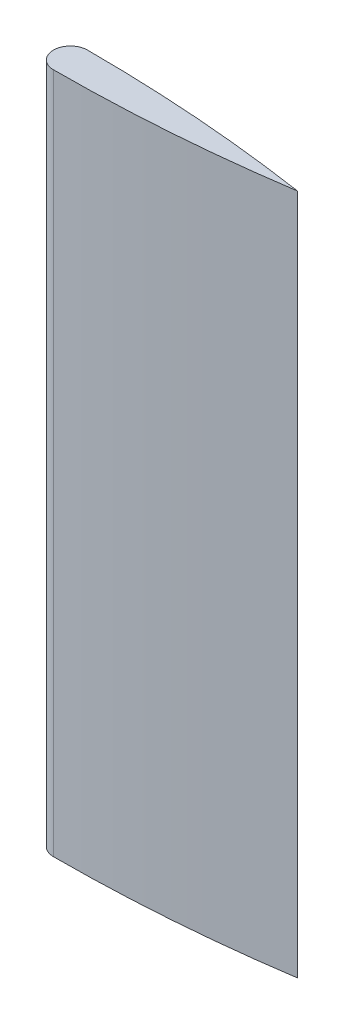
ISO-10303-21;
HEADER;
FILE_DESCRIPTION(('STEP AP214'),'2;1');
FILE_NAME('part.step','',(''),(''),'','','');
FILE_SCHEMA(('AUTOMOTIVE_DESIGN { 1 0 10303 214 1 1 1 1 }'));
ENDSEC;
DATA;
#1=APPLICATION_CONTEXT('core data for automotive mechanical design processes');
#2=APPLICATION_PROTOCOL_DEFINITION('international standard','automotive_design',2000,#1);
#3=PRODUCT_CONTEXT('',#1,'mechanical');
#4=PRODUCT('Part','Part','',(#3));
#5=PRODUCT_RELATED_PRODUCT_CATEGORY('part','',(#4));
#6=PRODUCT_DEFINITION_FORMATION('','',#4);
#7=PRODUCT_DEFINITION_CONTEXT('part definition',#1,'design');
#8=PRODUCT_DEFINITION('design','',#6,#7);
#9=PRODUCT_DEFINITION_SHAPE('','',#8);
#10=(LENGTH_UNIT() NAMED_UNIT(*) SI_UNIT(.MILLI.,.METRE.));
#11=(NAMED_UNIT(*) PLANE_ANGLE_UNIT() SI_UNIT($,.RADIAN.));
#12=(NAMED_UNIT(*) SI_UNIT($,.STERADIAN.) SOLID_ANGLE_UNIT());
#13=UNCERTAINTY_MEASURE_WITH_UNIT(LENGTH_MEASURE(1.E-05),#10,'distance_accuracy_value','');
#14=(GEOMETRIC_REPRESENTATION_CONTEXT(3) GLOBAL_UNCERTAINTY_ASSIGNED_CONTEXT((#13)) GLOBAL_UNIT_ASSIGNED_CONTEXT((#10,
#11,#12)) REPRESENTATION_CONTEXT('',''));
#15=CARTESIAN_POINT('',(0.,0.,0.));
#16=DIRECTION('',(0.,0.,1.));
#17=DIRECTION('',(1.,0.,0.));
#18=AXIS2_PLACEMENT_3D('',#15,#16,#17);
#19=CARTESIAN_POINT('',(0.,180.,397.75));
#20=DIRECTION('',(0.,-1.,0.));
#21=DIRECTION('',(0.,0.,-1.));
#22=AXIS2_PLACEMENT_3D('',#19,#20,#21);
#23=CYLINDRICAL_SURFACE('',#22,402.25);
#24=CARTESIAN_POINT('',(0.,0.,397.75));
#25=DIRECTION('',(0.,1.,0.));
#26=DIRECTION('',(0.,0.,-1.));
#27=AXIS2_PLACEMENT_3D('',#24,#25,#26);
#28=CIRCLE('',#27,402.25);
#29=CARTESIAN_POINT('',(59.9999999999999,0.,0.));
#30=VERTEX_POINT('',#29);
#31=CARTESIAN_POINT('',(0.,0.,-4.5));
#32=VERTEX_POINT('',#31);
#33=EDGE_CURVE('E80',#30,#32,#28,.T.);
#34=ORIENTED_EDGE('',*,*,#33,.T.);
#35=DIRECTION('',(0.,-1.,0.));
#36=VECTOR('',#35,1.);
#37=CARTESIAN_POINT('',(0.,180.,-4.5));
#38=LINE('',#37,#36);
#39=CARTESIAN_POINT('',(0.,180.,-4.5));
#40=VERTEX_POINT('',#39);
#41=EDGE_CURVE('E11',#40,#32,#38,.T.);
#42=ORIENTED_EDGE('',*,*,#41,.F.);
#43=CARTESIAN_POINT('',(0.,180.,397.75));
#44=DIRECTION('',(0.,1.,0.));
#45=DIRECTION('',(0.,0.,-1.));
#46=AXIS2_PLACEMENT_3D('',#43,#44,#45);
#47=CIRCLE('',#46,402.25);
#48=CARTESIAN_POINT('',(59.9999999999999,180.,0.));
#49=VERTEX_POINT('',#48);
#50=EDGE_CURVE('E73',#49,#40,#47,.T.);
#51=ORIENTED_EDGE('',*,*,#50,.F.);
#52=DIRECTION('',(0.,-1.,0.));
#53=VECTOR('',#52,1.);
#54=CARTESIAN_POINT('',(59.9999999999999,180.,0.));
#55=LINE('',#54,#53);
#56=EDGE_CURVE('E81',#49,#30,#55,.T.);
#57=ORIENTED_EDGE('',*,*,#56,.T.);
#58=EDGE_LOOP('',(#34,#42,#51,#57));
#59=FACE_BOUND('',#58,.T.);
#60=ADVANCED_FACE('F33',(#59),#23,.T.);
#61=CARTESIAN_POINT('',(0.,180.,0.));
#62=DIRECTION('',(0.,-1.,0.));
#63=DIRECTION('',(0.,0.,-1.));
#64=AXIS2_PLACEMENT_3D('',#61,#62,#63);
#65=CYLINDRICAL_SURFACE('',#64,4.5);
#66=CARTESIAN_POINT('',(0.,0.,0.));
#67=DIRECTION('',(0.,1.,0.));
#68=DIRECTION('',(0.,0.,1.));
#69=AXIS2_PLACEMENT_3D('',#66,#67,#68);
#70=CIRCLE('',#69,4.5);
#71=CARTESIAN_POINT('',(0.,0.,4.5));
#72=VERTEX_POINT('',#71);
#73=EDGE_CURVE('E61',#32,#72,#70,.T.);
#74=ORIENTED_EDGE('',*,*,#73,.T.);
#75=DIRECTION('',(0.,-1.,0.));
#76=VECTOR('',#75,1.);
#77=CARTESIAN_POINT('',(0.,180.,4.5));
#78=LINE('',#77,#76);
#79=CARTESIAN_POINT('',(0.,180.,4.5));
#80=VERTEX_POINT('',#79);
#81=EDGE_CURVE('E41',#80,#72,#78,.T.);
#82=ORIENTED_EDGE('',*,*,#81,.F.);
#83=CARTESIAN_POINT('',(0.,180.,0.));
#84=DIRECTION('',(0.,1.,0.));
#85=DIRECTION('',(0.,0.,1.));
#86=AXIS2_PLACEMENT_3D('',#83,#84,#85);
#87=CIRCLE('',#86,4.5);
#88=EDGE_CURVE('E69',#40,#80,#87,.T.);
#89=ORIENTED_EDGE('',*,*,#88,.F.);
#90=ORIENTED_EDGE('',*,*,#41,.T.);
#91=EDGE_LOOP('',(#74,#82,#89,#90));
#92=FACE_BOUND('',#91,.T.);
#93=ADVANCED_FACE('F70',(#92),#65,.T.);
#94=CARTESIAN_POINT('',(0.,180.,-397.75));
#95=DIRECTION('',(0.,-1.,0.));
#96=DIRECTION('',(0.,0.,-1.));
#97=AXIS2_PLACEMENT_3D('',#94,#95,#96);
#98=CYLINDRICAL_SURFACE('',#97,402.25);
#99=CARTESIAN_POINT('',(0.,0.,-397.75));
#100=DIRECTION('',(0.,1.,0.));
#101=DIRECTION('',(0.,0.,-1.));
#102=AXIS2_PLACEMENT_3D('',#99,#100,#101);
#103=CIRCLE('',#102,402.25);
#104=EDGE_CURVE('E66',#72,#30,#103,.T.);
#105=ORIENTED_EDGE('',*,*,#104,.T.);
#106=ORIENTED_EDGE('',*,*,#56,.F.);
#107=CARTESIAN_POINT('',(0.,180.,-397.75));
#108=DIRECTION('',(0.,1.,0.));
#109=DIRECTION('',(0.,0.,-1.));
#110=AXIS2_PLACEMENT_3D('',#107,#108,#109);
#111=CIRCLE('',#110,402.25);
#112=EDGE_CURVE('E49',#80,#49,#111,.T.);
#113=ORIENTED_EDGE('',*,*,#112,.F.);
#114=ORIENTED_EDGE('',*,*,#81,.T.);
#115=EDGE_LOOP('',(#105,#106,#113,#114));
#116=FACE_BOUND('',#115,.T.);
#117=ADVANCED_FACE('F88',(#116),#98,.T.);
#118=CARTESIAN_POINT('',(0.,180.,0.));
#119=DIRECTION('',(0.,-1.,0.));
#120=DIRECTION('',(0.,0.,-1.));
#121=AXIS2_PLACEMENT_3D('',#118,#119,#120);
#122=PLANE('',#121);
#123=ORIENTED_EDGE('',*,*,#50,.T.);
#124=ORIENTED_EDGE('',*,*,#88,.T.);
#125=ORIENTED_EDGE('',*,*,#112,.T.);
#126=EDGE_LOOP('',(#123,#124,#125));
#127=FACE_BOUND('',#126,.T.);
#128=ADVANCED_FACE('F76',(#127),#122,.F.);
#129=CARTESIAN_POINT('',(0.,0.,0.));
#130=DIRECTION('',(0.,-1.,0.));
#131=DIRECTION('',(0.,0.,-1.));
#132=AXIS2_PLACEMENT_3D('',#129,#130,#131);
#133=PLANE('',#132);
#134=ORIENTED_EDGE('',*,*,#33,.F.);
#135=ORIENTED_EDGE('',*,*,#104,.F.);
#136=ORIENTED_EDGE('',*,*,#73,.F.);
#137=EDGE_LOOP('',(#134,#135,#136));
#138=FACE_BOUND('',#137,.T.);
#139=ADVANCED_FACE('F89',(#138),#133,.T.);
#140=CLOSED_SHELL('',(#60,#93,#117,#128,#139));
#141=MANIFOLD_SOLID_BREP('B2',#140);
#142=ADVANCED_BREP_SHAPE_REPRESENTATION('',(#18,#141),#14);
#143=SHAPE_DEFINITION_REPRESENTATION(#9,#142);
ENDSEC;
END-ISO-10303-21;
